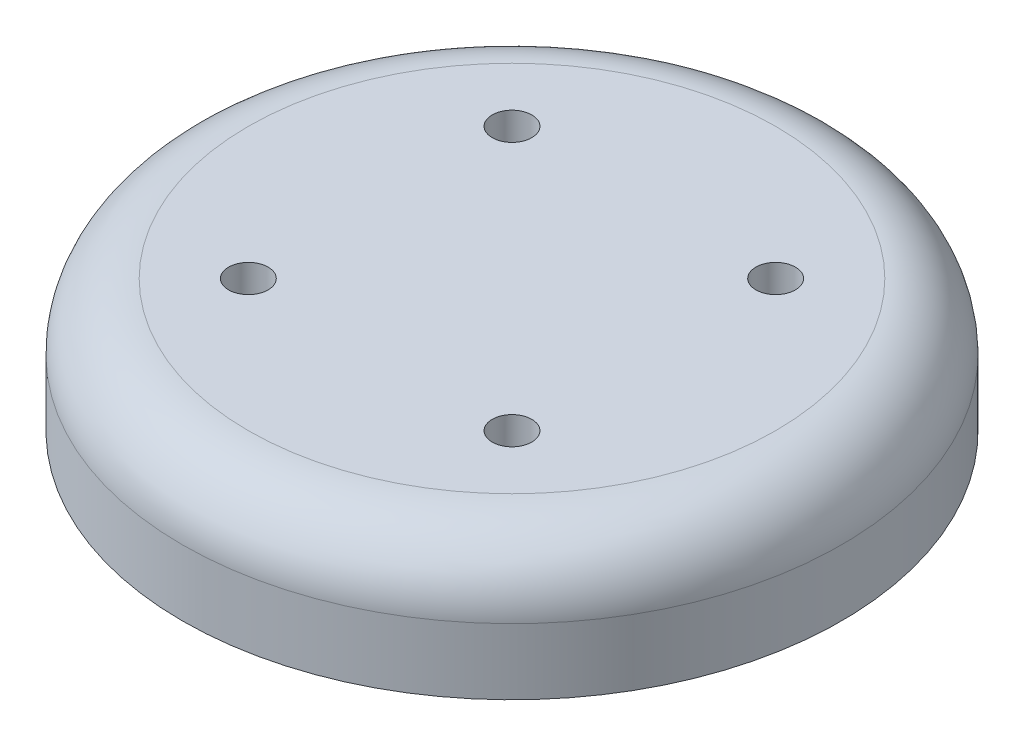
ISO-10303-21;
HEADER;
FILE_DESCRIPTION(('STEP AP214'),'2;1');
FILE_NAME('part.step','',(''),(''),'','','');
FILE_SCHEMA(('AUTOMOTIVE_DESIGN { 1 0 10303 214 1 1 1 1 }'));
ENDSEC;
DATA;
#1=APPLICATION_CONTEXT('core data for automotive mechanical design processes');
#2=APPLICATION_PROTOCOL_DEFINITION('international standard','automotive_design',2000,#1);
#3=PRODUCT_CONTEXT('',#1,'mechanical');
#4=PRODUCT('Part','Part','',(#3));
#5=PRODUCT_RELATED_PRODUCT_CATEGORY('part','',(#4));
#6=PRODUCT_DEFINITION_FORMATION('','',#4);
#7=PRODUCT_DEFINITION_CONTEXT('part definition',#1,'design');
#8=PRODUCT_DEFINITION('design','',#6,#7);
#9=PRODUCT_DEFINITION_SHAPE('','',#8);
#10=(LENGTH_UNIT() NAMED_UNIT(*) SI_UNIT(.MILLI.,.METRE.));
#11=(NAMED_UNIT(*) PLANE_ANGLE_UNIT() SI_UNIT($,.RADIAN.));
#12=(NAMED_UNIT(*) SI_UNIT($,.STERADIAN.) SOLID_ANGLE_UNIT());
#13=UNCERTAINTY_MEASURE_WITH_UNIT(LENGTH_MEASURE(1.E-05),#10,'distance_accuracy_value','');
#14=(GEOMETRIC_REPRESENTATION_CONTEXT(3) GLOBAL_UNCERTAINTY_ASSIGNED_CONTEXT((#13)) GLOBAL_UNIT_ASSIGNED_CONTEXT((#10,
#11,#12)) REPRESENTATION_CONTEXT('',''));
#15=CARTESIAN_POINT('',(0.,0.,0.));
#16=DIRECTION('',(0.,0.,1.));
#17=DIRECTION('',(1.,0.,0.));
#18=AXIS2_PLACEMENT_3D('',#15,#16,#17);
#19=CARTESIAN_POINT('',(-10.,0.,-10.));
#20=DIRECTION('',(0.,1.,0.));
#21=DIRECTION('',(0.,0.,1.));
#22=AXIS2_PLACEMENT_3D('',#19,#20,#21);
#23=CYLINDRICAL_SURFACE('',#22,1.5);
#24=CARTESIAN_POINT('',(-10.,10.,-10.));
#25=DIRECTION('',(0.,1.,0.));
#26=DIRECTION('',(0.,0.,1.));
#27=AXIS2_PLACEMENT_3D('',#24,#25,#26);
#28=CIRCLE('',#27,1.5);
#29=CARTESIAN_POINT('',(-10.,10.,-8.5));
#30=VERTEX_POINT('',#29);
#31=EDGE_CURVE('E49',#30,#30,#28,.T.);
#32=ORIENTED_EDGE('',*,*,#31,.T.);
#33=EDGE_LOOP('',(#32));
#34=FACE_BOUND('',#33,.T.);
#35=CARTESIAN_POINT('',(-10.,5.,-10.));
#36=DIRECTION('',(0.,-1.,0.));
#37=DIRECTION('',(0.,0.,-1.));
#38=AXIS2_PLACEMENT_3D('',#35,#36,#37);
#39=CIRCLE('',#38,1.5);
#40=CARTESIAN_POINT('',(-10.,5.,-11.5));
#41=VERTEX_POINT('',#40);
#42=EDGE_CURVE('E57',#41,#41,#39,.F.);
#43=ORIENTED_EDGE('',*,*,#42,.F.);
#44=EDGE_LOOP('',(#43));
#45=FACE_BOUND('',#44,.T.);
#46=ADVANCED_FACE('F32',(#34,#45),#23,.F.);
#47=CARTESIAN_POINT('',(-10.,0.,10.));
#48=DIRECTION('',(0.,1.,0.));
#49=DIRECTION('',(0.,0.,1.));
#50=AXIS2_PLACEMENT_3D('',#47,#48,#49);
#51=CYLINDRICAL_SURFACE('',#50,1.5);
#52=CARTESIAN_POINT('',(-10.,10.,10.));
#53=DIRECTION('',(0.,1.,0.));
#54=DIRECTION('',(0.,0.,1.));
#55=AXIS2_PLACEMENT_3D('',#52,#53,#54);
#56=CIRCLE('',#55,1.5);
#57=CARTESIAN_POINT('',(-10.,10.,11.5));
#58=VERTEX_POINT('',#57);
#59=EDGE_CURVE('E52',#58,#58,#56,.T.);
#60=ORIENTED_EDGE('',*,*,#59,.T.);
#61=EDGE_LOOP('',(#60));
#62=FACE_BOUND('',#61,.T.);
#63=CARTESIAN_POINT('',(-10.,5.,10.));
#64=DIRECTION('',(0.,-1.,0.));
#65=DIRECTION('',(0.,0.,-1.));
#66=AXIS2_PLACEMENT_3D('',#63,#64,#65);
#67=CIRCLE('',#66,1.5);
#68=CARTESIAN_POINT('',(-10.,5.,8.5));
#69=VERTEX_POINT('',#68);
#70=EDGE_CURVE('E64',#69,#69,#67,.F.);
#71=ORIENTED_EDGE('',*,*,#70,.F.);
#72=EDGE_LOOP('',(#71));
#73=FACE_BOUND('',#72,.T.);
#74=ADVANCED_FACE('F95',(#62,#73),#51,.F.);
#75=CARTESIAN_POINT('',(10.,0.,10.));
#76=DIRECTION('',(0.,1.,0.));
#77=DIRECTION('',(0.,0.,1.));
#78=AXIS2_PLACEMENT_3D('',#75,#76,#77);
#79=CYLINDRICAL_SURFACE('',#78,1.5);
#80=CARTESIAN_POINT('',(10.,10.,10.));
#81=DIRECTION('',(0.,1.,0.));
#82=DIRECTION('',(0.,0.,1.));
#83=AXIS2_PLACEMENT_3D('',#80,#81,#82);
#84=CIRCLE('',#83,1.5);
#85=CARTESIAN_POINT('',(10.,10.,11.5));
#86=VERTEX_POINT('',#85);
#87=EDGE_CURVE('E56',#86,#86,#84,.T.);
#88=ORIENTED_EDGE('',*,*,#87,.T.);
#89=EDGE_LOOP('',(#88));
#90=FACE_BOUND('',#89,.T.);
#91=CARTESIAN_POINT('',(10.,5.,10.));
#92=DIRECTION('',(0.,-1.,0.));
#93=DIRECTION('',(0.,0.,-1.));
#94=AXIS2_PLACEMENT_3D('',#91,#92,#93);
#95=CIRCLE('',#94,1.5);
#96=CARTESIAN_POINT('',(10.,5.,8.5));
#97=VERTEX_POINT('',#96);
#98=EDGE_CURVE('E67',#97,#97,#95,.F.);
#99=ORIENTED_EDGE('',*,*,#98,.F.);
#100=EDGE_LOOP('',(#99));
#101=FACE_BOUND('',#100,.T.);
#102=ADVANCED_FACE('F86',(#90,#101),#79,.F.);
#103=CARTESIAN_POINT('',(10.,0.,-10.));
#104=DIRECTION('',(0.,1.,0.));
#105=DIRECTION('',(0.,0.,1.));
#106=AXIS2_PLACEMENT_3D('',#103,#104,#105);
#107=CYLINDRICAL_SURFACE('',#106,1.5);
#108=CARTESIAN_POINT('',(10.,10.,-10.));
#109=DIRECTION('',(0.,1.,0.));
#110=DIRECTION('',(0.,0.,1.));
#111=AXIS2_PLACEMENT_3D('',#108,#109,#110);
#112=CIRCLE('',#111,1.5);
#113=CARTESIAN_POINT('',(10.,10.,-8.5));
#114=VERTEX_POINT('',#113);
#115=EDGE_CURVE('E53',#114,#114,#112,.T.);
#116=ORIENTED_EDGE('',*,*,#115,.T.);
#117=EDGE_LOOP('',(#116));
#118=FACE_BOUND('',#117,.T.);
#119=CARTESIAN_POINT('',(10.,5.,-10.));
#120=DIRECTION('',(0.,-1.,0.));
#121=DIRECTION('',(0.,0.,-1.));
#122=AXIS2_PLACEMENT_3D('',#119,#120,#121);
#123=CIRCLE('',#122,1.5);
#124=CARTESIAN_POINT('',(10.,5.,-11.5));
#125=VERTEX_POINT('',#124);
#126=EDGE_CURVE('E36',#125,#125,#123,.F.);
#127=ORIENTED_EDGE('',*,*,#126,.F.);
#128=EDGE_LOOP('',(#127));
#129=FACE_BOUND('',#128,.T.);
#130=ADVANCED_FACE('F83',(#118,#129),#107,.F.);
#131=CARTESIAN_POINT('',(0.,10.,0.));
#132=DIRECTION('',(0.,-1.,0.));
#133=DIRECTION('',(0.,0.,-1.));
#134=AXIS2_PLACEMENT_3D('',#131,#132,#133);
#135=CYLINDRICAL_SURFACE('',#134,25.);
#136=CARTESIAN_POINT('',(0.,5.,0.));
#137=DIRECTION('',(0.,1.,0.));
#138=DIRECTION('',(0.,0.,1.));
#139=AXIS2_PLACEMENT_3D('',#136,#137,#138);
#140=CIRCLE('',#139,25.);
#141=CARTESIAN_POINT('',(0.,5.,25.));
#142=VERTEX_POINT('',#141);
#143=EDGE_CURVE('E10',#142,#142,#140,.F.);
#144=ORIENTED_EDGE('',*,*,#143,.T.);
#145=EDGE_LOOP('',(#144));
#146=FACE_BOUND('',#145,.T.);
#147=CARTESIAN_POINT('',(0.,0.,0.));
#148=DIRECTION('',(0.,1.,0.));
#149=DIRECTION('',(0.,0.,1.));
#150=AXIS2_PLACEMENT_3D('',#147,#148,#149);
#151=CIRCLE('',#150,25.);
#152=CARTESIAN_POINT('',(0.,0.,25.));
#153=VERTEX_POINT('',#152);
#154=EDGE_CURVE('E44',#153,#153,#151,.T.);
#155=ORIENTED_EDGE('',*,*,#154,.T.);
#156=EDGE_LOOP('',(#155));
#157=FACE_BOUND('',#156,.T.);
#158=ADVANCED_FACE('F85',(#146,#157),#135,.T.);
#159=CARTESIAN_POINT('',(0.,10.,0.));
#160=DIRECTION('',(0.,1.,0.));
#161=DIRECTION('',(0.,0.,1.));
#162=AXIS2_PLACEMENT_3D('',#159,#160,#161);
#163=PLANE('',#162);
#164=ORIENTED_EDGE('',*,*,#115,.F.);
#165=EDGE_LOOP('',(#164));
#166=FACE_BOUND('',#165,.T.);
#167=ORIENTED_EDGE('',*,*,#87,.F.);
#168=EDGE_LOOP('',(#167));
#169=FACE_BOUND('',#168,.T.);
#170=ORIENTED_EDGE('',*,*,#59,.F.);
#171=EDGE_LOOP('',(#170));
#172=FACE_BOUND('',#171,.T.);
#173=ORIENTED_EDGE('',*,*,#31,.F.);
#174=EDGE_LOOP('',(#173));
#175=FACE_BOUND('',#174,.T.);
#176=CARTESIAN_POINT('',(0.,10.,0.));
#177=DIRECTION('',(0.,1.,0.));
#178=DIRECTION('',(0.,0.,1.));
#179=AXIS2_PLACEMENT_3D('',#176,#177,#178);
#180=CIRCLE('',#179,20.);
#181=CARTESIAN_POINT('',(0.,10.,20.));
#182=VERTEX_POINT('',#181);
#183=EDGE_CURVE('E40',#182,#182,#180,.T.);
#184=ORIENTED_EDGE('',*,*,#183,.T.);
#185=EDGE_LOOP('',(#184));
#186=FACE_BOUND('',#185,.T.);
#187=ADVANCED_FACE('F94',(#166,#169,#172,#175,#186),#163,.T.);
#188=CARTESIAN_POINT('',(0.,0.,0.));
#189=DIRECTION('',(0.,1.,0.));
#190=DIRECTION('',(0.,0.,1.));
#191=AXIS2_PLACEMENT_3D('',#188,#189,#190);
#192=PLANE('',#191);
#193=CARTESIAN_POINT('',(0.,0.,0.));
#194=DIRECTION('',(0.,-1.,0.));
#195=DIRECTION('',(0.,0.,-1.));
#196=AXIS2_PLACEMENT_3D('',#193,#194,#195);
#197=CIRCLE('',#196,20.);
#198=CARTESIAN_POINT('',(0.,0.,-20.));
#199=VERTEX_POINT('',#198);
#200=EDGE_CURVE('E70',#199,#199,#197,.T.);
#201=ORIENTED_EDGE('',*,*,#200,.F.);
#202=EDGE_LOOP('',(#201));
#203=FACE_BOUND('',#202,.T.);
#204=ORIENTED_EDGE('',*,*,#154,.F.);
#205=EDGE_LOOP('',(#204));
#206=FACE_BOUND('',#205,.T.);
#207=ADVANCED_FACE('F111',(#203,#206),#192,.F.);
#208=CARTESIAN_POINT('',(0.,5.,0.));
#209=DIRECTION('',(0.,1.,0.));
#210=DIRECTION('',(0.,0.,1.));
#211=AXIS2_PLACEMENT_3D('',#208,#209,#210);
#212=TOROIDAL_SURFACE('',#211,20.,5.);
#213=ORIENTED_EDGE('',*,*,#143,.F.);
#214=EDGE_LOOP('',(#213));
#215=FACE_BOUND('',#214,.T.);
#216=ORIENTED_EDGE('',*,*,#183,.F.);
#217=EDGE_LOOP('',(#216));
#218=FACE_BOUND('',#217,.T.);
#219=ADVANCED_FACE('F34',(#215,#218),#212,.T.);
#220=CARTESIAN_POINT('',(0.,5.,0.));
#221=DIRECTION('',(0.,-1.,0.));
#222=DIRECTION('',(0.,0.,-1.));
#223=AXIS2_PLACEMENT_3D('',#220,#221,#222);
#224=PLANE('',#223);
#225=CARTESIAN_POINT('',(0.,5.,0.));
#226=DIRECTION('',(0.,-1.,0.));
#227=DIRECTION('',(0.,0.,-1.));
#228=AXIS2_PLACEMENT_3D('',#225,#226,#227);
#229=CIRCLE('',#228,20.);
#230=CARTESIAN_POINT('',(0.,5.,-20.));
#231=VERTEX_POINT('',#230);
#232=EDGE_CURVE('E73',#231,#231,#229,.T.);
#233=ORIENTED_EDGE('',*,*,#232,.T.);
#234=EDGE_LOOP('',(#233));
#235=FACE_BOUND('',#234,.T.);
#236=ORIENTED_EDGE('',*,*,#126,.T.);
#237=EDGE_LOOP('',(#236));
#238=FACE_BOUND('',#237,.T.);
#239=ORIENTED_EDGE('',*,*,#98,.T.);
#240=EDGE_LOOP('',(#239));
#241=FACE_BOUND('',#240,.T.);
#242=ORIENTED_EDGE('',*,*,#70,.T.);
#243=EDGE_LOOP('',(#242));
#244=FACE_BOUND('',#243,.T.);
#245=ORIENTED_EDGE('',*,*,#42,.T.);
#246=EDGE_LOOP('',(#245));
#247=FACE_BOUND('',#246,.T.);
#248=ADVANCED_FACE('F80',(#235,#238,#241,#244,#247),#224,.T.);
#249=CARTESIAN_POINT('',(0.,5.,0.));
#250=DIRECTION('',(0.,-1.,0.));
#251=DIRECTION('',(0.,0.,-1.));
#252=AXIS2_PLACEMENT_3D('',#249,#250,#251);
#253=CYLINDRICAL_SURFACE('',#252,20.);
#254=ORIENTED_EDGE('',*,*,#232,.F.);
#255=EDGE_LOOP('',(#254));
#256=FACE_BOUND('',#255,.T.);
#257=ORIENTED_EDGE('',*,*,#200,.T.);
#258=EDGE_LOOP('',(#257));
#259=FACE_BOUND('',#258,.T.);
#260=ADVANCED_FACE('F124',(#256,#259),#253,.F.);
#261=CLOSED_SHELL('',(#46,#74,#102,#130,#158,#187,#207,#219,#248,#260));
#262=MANIFOLD_SOLID_BREP('B2',#261);
#263=ADVANCED_BREP_SHAPE_REPRESENTATION('',(#18,#262),#14);
#264=SHAPE_DEFINITION_REPRESENTATION(#9,#263);
ENDSEC;
END-ISO-10303-21;
